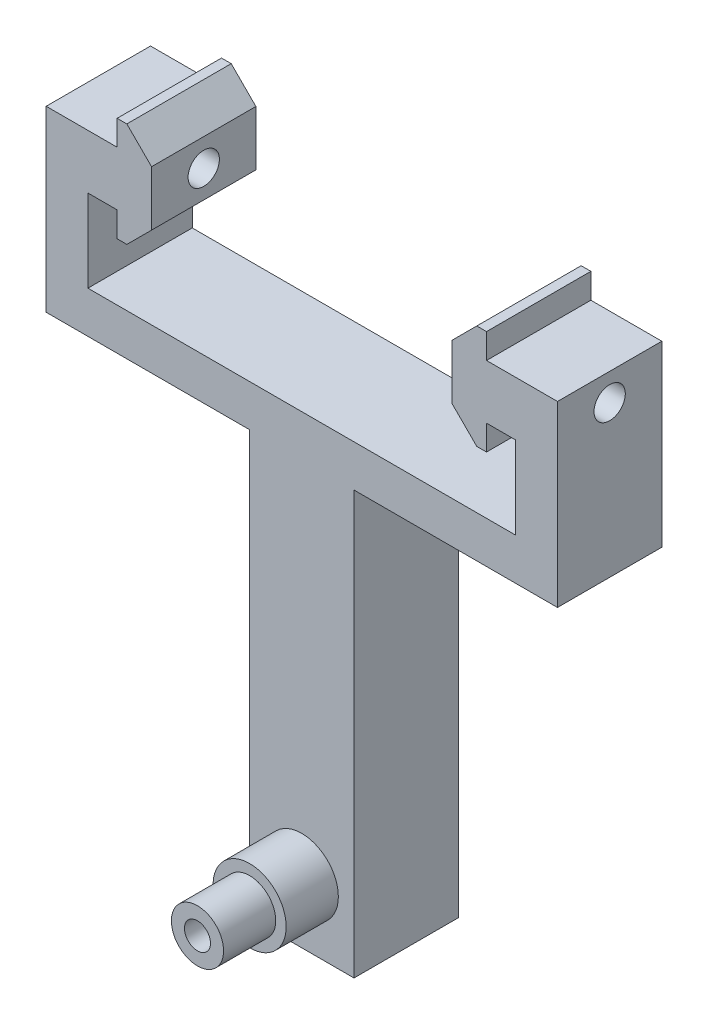
ISO-10303-21;
HEADER;
FILE_DESCRIPTION(('STEP AP214'),'2;1');
FILE_NAME('part.step','',(''),(''),'','','');
FILE_SCHEMA(('AUTOMOTIVE_DESIGN { 1 0 10303 214 1 1 1 1 }'));
ENDSEC;
DATA;
#1=APPLICATION_CONTEXT('core data for automotive mechanical design processes');
#2=APPLICATION_PROTOCOL_DEFINITION('international standard','automotive_design',2000,#1);
#3=PRODUCT_CONTEXT('',#1,'mechanical');
#4=PRODUCT('Part','Part','',(#3));
#5=PRODUCT_RELATED_PRODUCT_CATEGORY('part','',(#4));
#6=PRODUCT_DEFINITION_FORMATION('','',#4);
#7=PRODUCT_DEFINITION_CONTEXT('part definition',#1,'design');
#8=PRODUCT_DEFINITION('design','',#6,#7);
#9=PRODUCT_DEFINITION_SHAPE('','',#8);
#10=(LENGTH_UNIT() NAMED_UNIT(*) SI_UNIT(.MILLI.,.METRE.));
#11=(NAMED_UNIT(*) PLANE_ANGLE_UNIT() SI_UNIT($,.RADIAN.));
#12=(NAMED_UNIT(*) SI_UNIT($,.STERADIAN.) SOLID_ANGLE_UNIT());
#13=UNCERTAINTY_MEASURE_WITH_UNIT(LENGTH_MEASURE(1.E-05),#10,'distance_accuracy_value','');
#14=(GEOMETRIC_REPRESENTATION_CONTEXT(3) GLOBAL_UNCERTAINTY_ASSIGNED_CONTEXT((#13)) GLOBAL_UNIT_ASSIGNED_CONTEXT((#10,
#11,#12)) REPRESENTATION_CONTEXT('',''));
#15=CARTESIAN_POINT('',(0.,0.,0.));
#16=DIRECTION('',(0.,0.,1.));
#17=DIRECTION('',(1.,0.,0.));
#18=AXIS2_PLACEMENT_3D('',#15,#16,#17);
#19=CARTESIAN_POINT('',(-14.4999999999999,2.59999999999985,10.));
#20=DIRECTION('',(1.,0.,0.));
#21=DIRECTION('',(0.,1.,0.));
#22=AXIS2_PLACEMENT_3D('',#19,#20,#21);
#23=PLANE('',#22);
#24=CARTESIAN_POINT('',(-14.4999999999999,-1.62800247616818E-13,5.));
#25=DIRECTION('',(-1.,0.,0.));
#26=DIRECTION('',(0.,-1.,0.));
#27=AXIS2_PLACEMENT_3D('',#24,#25,#26);
#28=CIRCLE('',#27,1.5);
#29=CARTESIAN_POINT('',(-14.4999999999999,-1.50000000000016,5.));
#30=VERTEX_POINT('',#29);
#31=EDGE_CURVE('E445',#30,#30,#28,.T.);
#32=ORIENTED_EDGE('',*,*,#31,.F.);
#33=EDGE_LOOP('',(#32));
#34=FACE_BOUND('',#33,.T.);
#35=DIRECTION('',(0.,-1.,0.));
#36=VECTOR('',#35,1.);
#37=CARTESIAN_POINT('',(-14.4999999999999,2.59999999999985,0.));
#38=LINE('',#37,#36);
#39=CARTESIAN_POINT('',(-14.4999999999999,2.59999999999985,0.));
#40=VERTEX_POINT('',#39);
#41=CARTESIAN_POINT('',(-14.4999999999999,-14.5,0.));
#42=VERTEX_POINT('',#41);
#43=EDGE_CURVE('E262',#40,#42,#38,.T.);
#44=ORIENTED_EDGE('',*,*,#43,.T.);
#45=DIRECTION('',(0.,0.,-1.));
#46=VECTOR('',#45,1.);
#47=CARTESIAN_POINT('',(-14.4999999999999,-14.5,10.));
#48=LINE('',#47,#46);
#49=CARTESIAN_POINT('',(-14.4999999999999,-14.5,10.));
#50=VERTEX_POINT('',#49);
#51=EDGE_CURVE('E11',#50,#42,#48,.T.);
#52=ORIENTED_EDGE('',*,*,#51,.F.);
#53=DIRECTION('',(0.,-1.,0.));
#54=VECTOR('',#53,1.);
#55=CARTESIAN_POINT('',(-14.4999999999999,2.59999999999985,10.));
#56=LINE('',#55,#54);
#57=CARTESIAN_POINT('',(-14.4999999999999,2.59999999999985,10.));
#58=VERTEX_POINT('',#57);
#59=EDGE_CURVE('E345',#58,#50,#56,.T.);
#60=ORIENTED_EDGE('',*,*,#59,.F.);
#61=DIRECTION('',(0.,0.,-1.));
#62=VECTOR('',#61,1.);
#63=CARTESIAN_POINT('',(-14.4999999999999,2.59999999999985,10.));
#64=LINE('',#63,#62);
#65=EDGE_CURVE('E258',#58,#40,#64,.T.);
#66=ORIENTED_EDGE('',*,*,#65,.T.);
#67=EDGE_LOOP('',(#44,#52,#60,#66));
#68=FACE_BOUND('',#67,.T.);
#69=ADVANCED_FACE('F39',(#34,#68),#23,.F.);
#70=CARTESIAN_POINT('',(-14.4999999999999,-14.5,10.));
#71=DIRECTION('',(0.,1.,0.));
#72=DIRECTION('',(0.,0.,1.));
#73=AXIS2_PLACEMENT_3D('',#70,#71,#72);
#74=PLANE('',#73);
#75=DIRECTION('',(1.,0.,0.));
#76=VECTOR('',#75,1.);
#77=CARTESIAN_POINT('',(-14.4999999999999,-14.5,0.));
#78=LINE('',#77,#76);
#79=CARTESIAN_POINT('',(5.00000000000002,-14.5,0.));
#80=VERTEX_POINT('',#79);
#81=EDGE_CURVE('E266',#42,#80,#78,.T.);
#82=ORIENTED_EDGE('',*,*,#81,.T.);
#83=DIRECTION('',(0.,0.,-1.));
#84=VECTOR('',#83,1.);
#85=CARTESIAN_POINT('',(5.00000000000002,-14.5,10.));
#86=LINE('',#85,#84);
#87=CARTESIAN_POINT('',(5.00000000000002,-14.5,10.));
#88=VERTEX_POINT('',#87);
#89=EDGE_CURVE('E49',#88,#80,#86,.T.);
#90=ORIENTED_EDGE('',*,*,#89,.F.);
#91=DIRECTION('',(1.,0.,0.));
#92=VECTOR('',#91,1.);
#93=CARTESIAN_POINT('',(-14.4999999999999,-14.5,10.));
#94=LINE('',#93,#92);
#95=EDGE_CURVE('E161',#50,#88,#94,.T.);
#96=ORIENTED_EDGE('',*,*,#95,.F.);
#97=ORIENTED_EDGE('',*,*,#51,.T.);
#98=EDGE_LOOP('',(#82,#90,#96,#97));
#99=FACE_BOUND('',#98,.T.);
#100=ADVANCED_FACE('F565',(#99),#74,.F.);
#101=CARTESIAN_POINT('',(5.00000000000002,-14.5,10.));
#102=DIRECTION('',(1.,0.,0.));
#103=DIRECTION('',(0.,1.,0.));
#104=AXIS2_PLACEMENT_3D('',#101,#102,#103);
#105=PLANE('',#104);
#106=DIRECTION('',(0.,-1.,0.));
#107=VECTOR('',#106,1.);
#108=CARTESIAN_POINT('',(5.00000000000002,-14.5,0.));
#109=LINE('',#108,#107);
#110=CARTESIAN_POINT('',(5.00000000000002,-55.,0.));
#111=VERTEX_POINT('',#110);
#112=EDGE_CURVE('E270',#80,#111,#109,.T.);
#113=ORIENTED_EDGE('',*,*,#112,.T.);
#114=DIRECTION('',(0.,0.,-1.));
#115=VECTOR('',#114,1.);
#116=CARTESIAN_POINT('',(5.00000000000002,-55.,10.));
#117=LINE('',#116,#115);
#118=CARTESIAN_POINT('',(5.00000000000002,-55.,10.));
#119=VERTEX_POINT('',#118);
#120=EDGE_CURVE('E436',#119,#111,#117,.T.);
#121=ORIENTED_EDGE('',*,*,#120,.F.);
#122=DIRECTION('',(0.,-1.,0.));
#123=VECTOR('',#122,1.);
#124=CARTESIAN_POINT('',(5.00000000000002,-14.5,10.));
#125=LINE('',#124,#123);
#126=EDGE_CURVE('E470',#88,#119,#125,.T.);
#127=ORIENTED_EDGE('',*,*,#126,.F.);
#128=ORIENTED_EDGE('',*,*,#89,.T.);
#129=EDGE_LOOP('',(#113,#121,#127,#128));
#130=FACE_BOUND('',#129,.T.);
#131=ADVANCED_FACE('F570',(#130),#105,.F.);
#132=CARTESIAN_POINT('',(5.00000000000002,-55.,10.));
#133=DIRECTION('',(0.,1.,0.));
#134=DIRECTION('',(0.,0.,1.));
#135=AXIS2_PLACEMENT_3D('',#132,#133,#134);
#136=PLANE('',#135);
#137=DIRECTION('',(1.,0.,0.));
#138=VECTOR('',#137,1.);
#139=CARTESIAN_POINT('',(5.00000000000002,-55.,0.));
#140=LINE('',#139,#138);
#141=CARTESIAN_POINT('',(14.9999999999999,-55.,0.));
#142=VERTEX_POINT('',#141);
#143=EDGE_CURVE('E273',#111,#142,#140,.T.);
#144=ORIENTED_EDGE('',*,*,#143,.T.);
#145=DIRECTION('',(0.,0.,-1.));
#146=VECTOR('',#145,1.);
#147=CARTESIAN_POINT('',(14.9999999999999,-55.,10.));
#148=LINE('',#147,#146);
#149=CARTESIAN_POINT('',(14.9999999999999,-55.,10.));
#150=VERTEX_POINT('',#149);
#151=EDGE_CURVE('E432',#150,#142,#148,.T.);
#152=ORIENTED_EDGE('',*,*,#151,.F.);
#153=DIRECTION('',(1.,0.,0.));
#154=VECTOR('',#153,1.);
#155=CARTESIAN_POINT('',(5.00000000000002,-55.,10.));
#156=LINE('',#155,#154);
#157=EDGE_CURVE('E473',#119,#150,#156,.T.);
#158=ORIENTED_EDGE('',*,*,#157,.F.);
#159=ORIENTED_EDGE('',*,*,#120,.T.);
#160=EDGE_LOOP('',(#144,#152,#158,#159));
#161=FACE_BOUND('',#160,.T.);
#162=ADVANCED_FACE('F662',(#161),#136,.F.);
#163=CARTESIAN_POINT('',(15.,-14.5,10.));
#164=DIRECTION('',(-1.,0.,0.));
#165=DIRECTION('',(0.,-1.,0.));
#166=AXIS2_PLACEMENT_3D('',#163,#164,#165);
#167=PLANE('',#166);
#168=DIRECTION('',(0.,1.,0.));
#169=VECTOR('',#168,1.);
#170=CARTESIAN_POINT('',(15.,-14.5,0.));
#171=LINE('',#170,#169);
#172=CARTESIAN_POINT('',(15.,-14.5,0.));
#173=VERTEX_POINT('',#172);
#174=EDGE_CURVE('E276',#142,#173,#171,.T.);
#175=ORIENTED_EDGE('',*,*,#174,.T.);
#176=DIRECTION('',(0.,0.,-1.));
#177=VECTOR('',#176,1.);
#178=CARTESIAN_POINT('',(15.,-14.5,10.));
#179=LINE('',#178,#177);
#180=CARTESIAN_POINT('',(15.,-14.5,10.));
#181=VERTEX_POINT('',#180);
#182=EDGE_CURVE('E428',#181,#173,#179,.T.);
#183=ORIENTED_EDGE('',*,*,#182,.F.);
#184=DIRECTION('',(0.,1.,0.));
#185=VECTOR('',#184,1.);
#186=CARTESIAN_POINT('',(15.,-14.5,10.));
#187=LINE('',#186,#185);
#188=EDGE_CURVE('E476',#150,#181,#187,.T.);
#189=ORIENTED_EDGE('',*,*,#188,.F.);
#190=ORIENTED_EDGE('',*,*,#151,.T.);
#191=EDGE_LOOP('',(#175,#183,#189,#190));
#192=FACE_BOUND('',#191,.T.);
#193=ADVANCED_FACE('F658',(#192),#167,.F.);
#194=CARTESIAN_POINT('',(34.4999999999999,-14.5,10.));
#195=DIRECTION('',(0.,1.,0.));
#196=DIRECTION('',(-1.,0.,0.));
#197=AXIS2_PLACEMENT_3D('',#194,#195,#196);
#198=PLANE('',#197);
#199=DIRECTION('',(1.,0.,0.));
#200=VECTOR('',#199,1.);
#201=CARTESIAN_POINT('',(34.4999999999999,-14.5,0.));
#202=LINE('',#201,#200);
#203=CARTESIAN_POINT('',(34.4999999999999,-14.5,0.));
#204=VERTEX_POINT('',#203);
#205=EDGE_CURVE('E279',#173,#204,#202,.T.);
#206=ORIENTED_EDGE('',*,*,#205,.T.);
#207=DIRECTION('',(0.,0.,-1.));
#208=VECTOR('',#207,1.);
#209=CARTESIAN_POINT('',(34.4999999999999,-14.5,10.));
#210=LINE('',#209,#208);
#211=CARTESIAN_POINT('',(34.4999999999999,-14.5,10.));
#212=VERTEX_POINT('',#211);
#213=EDGE_CURVE('E424',#212,#204,#210,.T.);
#214=ORIENTED_EDGE('',*,*,#213,.F.);
#215=DIRECTION('',(1.,0.,0.));
#216=VECTOR('',#215,1.);
#217=CARTESIAN_POINT('',(34.4999999999999,-14.5,10.));
#218=LINE('',#217,#216);
#219=EDGE_CURVE('E479',#181,#212,#218,.T.);
#220=ORIENTED_EDGE('',*,*,#219,.F.);
#221=ORIENTED_EDGE('',*,*,#182,.T.);
#222=EDGE_LOOP('',(#206,#214,#220,#221));
#223=FACE_BOUND('',#222,.T.);
#224=ADVANCED_FACE('F654',(#223),#198,.F.);
#225=CARTESIAN_POINT('',(34.5,2.59999999999981,10.));
#226=DIRECTION('',(-1.,0.,0.));
#227=DIRECTION('',(0.,-1.,0.));
#228=AXIS2_PLACEMENT_3D('',#225,#226,#227);
#229=PLANE('',#228);
#230=CARTESIAN_POINT('',(34.5,-1.99836591292777E-13,5.));
#231=DIRECTION('',(1.,0.,0.));
#232=DIRECTION('',(0.,1.,0.));
#233=AXIS2_PLACEMENT_3D('',#230,#231,#232);
#234=CIRCLE('',#233,1.5);
#235=CARTESIAN_POINT('',(34.5,1.4999999999998,5.));
#236=VERTEX_POINT('',#235);
#237=EDGE_CURVE('E449',#236,#236,#234,.T.);
#238=ORIENTED_EDGE('',*,*,#237,.F.);
#239=EDGE_LOOP('',(#238));
#240=FACE_BOUND('',#239,.T.);
#241=DIRECTION('',(0.,1.,0.));
#242=VECTOR('',#241,1.);
#243=CARTESIAN_POINT('',(34.5,2.59999999999981,0.));
#244=LINE('',#243,#242);
#245=CARTESIAN_POINT('',(34.5,2.59999999999981,0.));
#246=VERTEX_POINT('',#245);
#247=EDGE_CURVE('E282',#204,#246,#244,.T.);
#248=ORIENTED_EDGE('',*,*,#247,.T.);
#249=DIRECTION('',(0.,0.,-1.));
#250=VECTOR('',#249,1.);
#251=CARTESIAN_POINT('',(34.5,2.59999999999981,10.));
#252=LINE('',#251,#250);
#253=CARTESIAN_POINT('',(34.5,2.59999999999981,10.));
#254=VERTEX_POINT('',#253);
#255=EDGE_CURVE('E420',#254,#246,#252,.T.);
#256=ORIENTED_EDGE('',*,*,#255,.F.);
#257=DIRECTION('',(0.,1.,0.));
#258=VECTOR('',#257,1.);
#259=CARTESIAN_POINT('',(34.5,2.59999999999981,10.));
#260=LINE('',#259,#258);
#261=EDGE_CURVE('E482',#212,#254,#260,.T.);
#262=ORIENTED_EDGE('',*,*,#261,.F.);
#263=ORIENTED_EDGE('',*,*,#213,.T.);
#264=EDGE_LOOP('',(#248,#256,#262,#263));
#265=FACE_BOUND('',#264,.T.);
#266=ADVANCED_FACE('F650',(#240,#265),#229,.F.);
#267=CARTESIAN_POINT('',(34.5,2.59999999999981,10.));
#268=DIRECTION('',(0.,-1.,0.));
#269=DIRECTION('',(1.,0.,0.));
#270=AXIS2_PLACEMENT_3D('',#267,#268,#269);
#271=PLANE('',#270);
#272=DIRECTION('',(-1.,0.,0.));
#273=VECTOR('',#272,1.);
#274=CARTESIAN_POINT('',(34.5,2.59999999999981,0.));
#275=LINE('',#274,#273);
#276=CARTESIAN_POINT('',(27.7000000000001,2.59999999999982,0.));
#277=VERTEX_POINT('',#276);
#278=EDGE_CURVE('E285',#246,#277,#275,.T.);
#279=ORIENTED_EDGE('',*,*,#278,.T.);
#280=DIRECTION('',(0.,0.,-1.));
#281=VECTOR('',#280,1.);
#282=CARTESIAN_POINT('',(27.7000000000001,2.59999999999982,10.));
#283=LINE('',#282,#281);
#284=CARTESIAN_POINT('',(27.7000000000001,2.59999999999982,10.));
#285=VERTEX_POINT('',#284);
#286=EDGE_CURVE('E416',#285,#277,#283,.T.);
#287=ORIENTED_EDGE('',*,*,#286,.F.);
#288=DIRECTION('',(-1.,0.,0.));
#289=VECTOR('',#288,1.);
#290=CARTESIAN_POINT('',(34.5,2.59999999999981,10.));
#291=LINE('',#290,#289);
#292=EDGE_CURVE('E485',#254,#285,#291,.T.);
#293=ORIENTED_EDGE('',*,*,#292,.F.);
#294=ORIENTED_EDGE('',*,*,#255,.T.);
#295=EDGE_LOOP('',(#279,#287,#293,#294));
#296=FACE_BOUND('',#295,.T.);
#297=ADVANCED_FACE('F646',(#296),#271,.F.);
#298=CARTESIAN_POINT('',(27.7000000000001,2.59999999999982,10.));
#299=DIRECTION('',(-1.,0.,0.));
#300=DIRECTION('',(0.,0.,1.));
#301=AXIS2_PLACEMENT_3D('',#298,#299,#300);
#302=PLANE('',#301);
#303=DIRECTION('',(0.,1.,0.));
#304=VECTOR('',#303,1.);
#305=CARTESIAN_POINT('',(27.7000000000001,2.59999999999982,0.));
#306=LINE('',#305,#304);
#307=CARTESIAN_POINT('',(27.7000000000001,4.99999999999982,0.));
#308=VERTEX_POINT('',#307);
#309=EDGE_CURVE('E288',#277,#308,#306,.T.);
#310=ORIENTED_EDGE('',*,*,#309,.T.);
#311=DIRECTION('',(0.,0.,-1.));
#312=VECTOR('',#311,1.);
#313=CARTESIAN_POINT('',(27.7000000000001,4.99999999999982,10.));
#314=LINE('',#313,#312);
#315=CARTESIAN_POINT('',(27.7000000000001,4.99999999999982,10.));
#316=VERTEX_POINT('',#315);
#317=EDGE_CURVE('E412',#316,#308,#314,.T.);
#318=ORIENTED_EDGE('',*,*,#317,.F.);
#319=DIRECTION('',(0.,1.,0.));
#320=VECTOR('',#319,1.);
#321=CARTESIAN_POINT('',(27.7000000000001,2.59999999999982,10.));
#322=LINE('',#321,#320);
#323=EDGE_CURVE('E488',#285,#316,#322,.T.);
#324=ORIENTED_EDGE('',*,*,#323,.F.);
#325=ORIENTED_EDGE('',*,*,#286,.T.);
#326=EDGE_LOOP('',(#310,#318,#324,#325));
#327=FACE_BOUND('',#326,.T.);
#328=ADVANCED_FACE('F642',(#327),#302,.F.);
#329=CARTESIAN_POINT('',(27.7000000000001,4.99999999999982,10.));
#330=DIRECTION('',(0.,-1.,0.));
#331=DIRECTION('',(1.,0.,0.));
#332=AXIS2_PLACEMENT_3D('',#329,#330,#331);
#333=PLANE('',#332);
#334=DIRECTION('',(-1.,0.,0.));
#335=VECTOR('',#334,1.);
#336=CARTESIAN_POINT('',(27.7000000000001,4.99999999999982,0.));
#337=LINE('',#336,#335);
#338=CARTESIAN_POINT('',(26.7677669529665,4.99999999999982,0.));
#339=VERTEX_POINT('',#338);
#340=EDGE_CURVE('E291',#308,#339,#337,.T.);
#341=ORIENTED_EDGE('',*,*,#340,.T.);
#342=DIRECTION('',(0.,0.,-1.));
#343=VECTOR('',#342,1.);
#344=CARTESIAN_POINT('',(26.7677669529665,4.99999999999982,10.));
#345=LINE('',#344,#343);
#346=CARTESIAN_POINT('',(26.7677669529665,4.99999999999982,10.));
#347=VERTEX_POINT('',#346);
#348=EDGE_CURVE('E408',#347,#339,#345,.T.);
#349=ORIENTED_EDGE('',*,*,#348,.F.);
#350=DIRECTION('',(-1.,0.,0.));
#351=VECTOR('',#350,1.);
#352=CARTESIAN_POINT('',(27.7000000000001,4.99999999999982,10.));
#353=LINE('',#352,#351);
#354=EDGE_CURVE('E491',#316,#347,#353,.T.);
#355=ORIENTED_EDGE('',*,*,#354,.F.);
#356=ORIENTED_EDGE('',*,*,#317,.T.);
#357=EDGE_LOOP('',(#341,#349,#355,#356));
#358=FACE_BOUND('',#357,.T.);
#359=ADVANCED_FACE('F638',(#358),#333,.F.);
#360=CARTESIAN_POINT('',(26.7677669529665,4.99999999999982,10.));
#361=DIRECTION('',(0.707106781186547,-0.707106781186548,0.));
#362=DIRECTION('',(0.707106781186548,0.707106781186547,0.));
#363=AXIS2_PLACEMENT_3D('',#360,#361,#362);
#364=PLANE('',#363);
#365=DIRECTION('',(-0.707106781186548,-0.707106781186547,0.));
#366=VECTOR('',#365,1.);
#367=CARTESIAN_POINT('',(26.7677669529665,4.99999999999982,0.));
#368=LINE('',#367,#366);
#369=CARTESIAN_POINT('',(24.4000000000001,2.63223304703345,0.));
#370=VERTEX_POINT('',#369);
#371=EDGE_CURVE('E294',#339,#370,#368,.T.);
#372=ORIENTED_EDGE('',*,*,#371,.T.);
#373=DIRECTION('',(0.,0.,-1.));
#374=VECTOR('',#373,1.);
#375=CARTESIAN_POINT('',(24.4000000000001,2.63223304703345,10.));
#376=LINE('',#375,#374);
#377=CARTESIAN_POINT('',(24.4000000000001,2.63223304703345,10.));
#378=VERTEX_POINT('',#377);
#379=EDGE_CURVE('E404',#378,#370,#376,.T.);
#380=ORIENTED_EDGE('',*,*,#379,.F.);
#381=DIRECTION('',(-0.707106781186548,-0.707106781186547,0.));
#382=VECTOR('',#381,1.);
#383=CARTESIAN_POINT('',(26.7677669529665,4.99999999999982,10.));
#384=LINE('',#383,#382);
#385=EDGE_CURVE('E494',#347,#378,#384,.T.);
#386=ORIENTED_EDGE('',*,*,#385,.F.);
#387=ORIENTED_EDGE('',*,*,#348,.T.);
#388=EDGE_LOOP('',(#372,#380,#386,#387));
#389=FACE_BOUND('',#388,.T.);
#390=ADVANCED_FACE('F635',(#389),#364,.F.);
#391=CARTESIAN_POINT('',(24.4000000000001,2.63223304703345,10.));
#392=DIRECTION('',(1.,0.,0.));
#393=DIRECTION('',(0.,1.,0.));
#394=AXIS2_PLACEMENT_3D('',#391,#392,#393);
#395=PLANE('',#394);
#396=CARTESIAN_POINT('',(24.4000000000001,-1.8344294721571E-13,5.));
#397=DIRECTION('',(1.,0.,0.));
#398=DIRECTION('',(0.,1.,0.));
#399=AXIS2_PLACEMENT_3D('',#396,#397,#398);
#400=CIRCLE('',#399,1.5);
#401=CARTESIAN_POINT('',(24.4000000000001,1.49999999999982,5.));
#402=VERTEX_POINT('',#401);
#403=EDGE_CURVE('E446',#402,#402,#400,.T.);
#404=ORIENTED_EDGE('',*,*,#403,.T.);
#405=EDGE_LOOP('',(#404));
#406=FACE_BOUND('',#405,.T.);
#407=DIRECTION('',(0.,-1.,0.));
#408=VECTOR('',#407,1.);
#409=CARTESIAN_POINT('',(24.4000000000001,2.63223304703345,0.));
#410=LINE('',#409,#408);
#411=CARTESIAN_POINT('',(24.4000000000001,-2.63223304703382,0.));
#412=VERTEX_POINT('',#411);
#413=EDGE_CURVE('E297',#370,#412,#410,.T.);
#414=ORIENTED_EDGE('',*,*,#413,.T.);
#415=DIRECTION('',(0.,0.,-1.));
#416=VECTOR('',#415,1.);
#417=CARTESIAN_POINT('',(24.4000000000001,-2.63223304703382,10.));
#418=LINE('',#417,#416);
#419=CARTESIAN_POINT('',(24.4000000000001,-2.63223304703382,10.));
#420=VERTEX_POINT('',#419);
#421=EDGE_CURVE('E400',#420,#412,#418,.T.);
#422=ORIENTED_EDGE('',*,*,#421,.F.);
#423=DIRECTION('',(0.,-1.,0.));
#424=VECTOR('',#423,1.);
#425=CARTESIAN_POINT('',(24.4000000000001,2.63223304703345,10.));
#426=LINE('',#425,#424);
#427=EDGE_CURVE('E497',#378,#420,#426,.T.);
#428=ORIENTED_EDGE('',*,*,#427,.F.);
#429=ORIENTED_EDGE('',*,*,#379,.T.);
#430=EDGE_LOOP('',(#414,#422,#428,#429));
#431=FACE_BOUND('',#430,.T.);
#432=ADVANCED_FACE('F631',(#406,#431),#395,.F.);
#433=CARTESIAN_POINT('',(24.4000000000001,-2.63223304703382,10.));
#434=DIRECTION('',(0.707106781186548,0.707106781186547,0.));
#435=DIRECTION('',(-0.707106781186547,0.707106781186548,0.));
#436=AXIS2_PLACEMENT_3D('',#433,#434,#435);
#437=PLANE('',#436);
#438=DIRECTION('',(0.707106781186547,-0.707106781186548,0.));
#439=VECTOR('',#438,1.);
#440=CARTESIAN_POINT('',(24.4000000000001,-2.63223304703382,0.));
#441=LINE('',#440,#439);
#442=CARTESIAN_POINT('',(26.7677669529664,-5.00000000000016,0.));
#443=VERTEX_POINT('',#442);
#444=EDGE_CURVE('E300',#412,#443,#441,.T.);
#445=ORIENTED_EDGE('',*,*,#444,.T.);
#446=DIRECTION('',(0.,0.,-1.));
#447=VECTOR('',#446,1.);
#448=CARTESIAN_POINT('',(26.7677669529664,-5.00000000000016,10.));
#449=LINE('',#448,#447);
#450=CARTESIAN_POINT('',(26.7677669529664,-5.00000000000016,10.));
#451=VERTEX_POINT('',#450);
#452=EDGE_CURVE('E396',#451,#443,#449,.T.);
#453=ORIENTED_EDGE('',*,*,#452,.F.);
#454=DIRECTION('',(0.707106781186547,-0.707106781186548,0.));
#455=VECTOR('',#454,1.);
#456=CARTESIAN_POINT('',(24.4000000000001,-2.63223304703382,10.));
#457=LINE('',#456,#455);
#458=EDGE_CURVE('E500',#420,#451,#457,.T.);
#459=ORIENTED_EDGE('',*,*,#458,.F.);
#460=ORIENTED_EDGE('',*,*,#421,.T.);
#461=EDGE_LOOP('',(#445,#453,#459,#460));
#462=FACE_BOUND('',#461,.T.);
#463=ADVANCED_FACE('F627',(#462),#437,.F.);
#464=CARTESIAN_POINT('',(26.7677669529664,-5.00000000000016,10.));
#465=DIRECTION('',(0.,1.,0.));
#466=DIRECTION('',(0.,0.,1.));
#467=AXIS2_PLACEMENT_3D('',#464,#465,#466);
#468=PLANE('',#467);
#469=DIRECTION('',(1.,0.,0.));
#470=VECTOR('',#469,1.);
#471=CARTESIAN_POINT('',(26.7677669529664,-5.00000000000016,0.));
#472=LINE('',#471,#470);
#473=CARTESIAN_POINT('',(27.6999999999999,-5.00000000000016,0.));
#474=VERTEX_POINT('',#473);
#475=EDGE_CURVE('E303',#443,#474,#472,.T.);
#476=ORIENTED_EDGE('',*,*,#475,.T.);
#477=DIRECTION('',(0.,0.,-1.));
#478=VECTOR('',#477,1.);
#479=CARTESIAN_POINT('',(27.6999999999999,-5.00000000000016,10.));
#480=LINE('',#479,#478);
#481=CARTESIAN_POINT('',(27.6999999999999,-5.00000000000016,10.));
#482=VERTEX_POINT('',#481);
#483=EDGE_CURVE('E392',#482,#474,#480,.T.);
#484=ORIENTED_EDGE('',*,*,#483,.F.);
#485=DIRECTION('',(1.,0.,0.));
#486=VECTOR('',#485,1.);
#487=CARTESIAN_POINT('',(26.7677669529664,-5.00000000000016,10.));
#488=LINE('',#487,#486);
#489=EDGE_CURVE('E503',#451,#482,#488,.T.);
#490=ORIENTED_EDGE('',*,*,#489,.F.);
#491=ORIENTED_EDGE('',*,*,#452,.T.);
#492=EDGE_LOOP('',(#476,#484,#490,#491));
#493=FACE_BOUND('',#492,.T.);
#494=ADVANCED_FACE('F623',(#493),#468,.F.);
#495=CARTESIAN_POINT('',(27.6999999999999,-5.00000000000016,10.));
#496=DIRECTION('',(-1.,0.,0.));
#497=DIRECTION('',(0.,0.,1.));
#498=AXIS2_PLACEMENT_3D('',#495,#496,#497);
#499=PLANE('',#498);
#500=DIRECTION('',(0.,1.,0.));
#501=VECTOR('',#500,1.);
#502=CARTESIAN_POINT('',(27.6999999999999,-5.00000000000016,0.));
#503=LINE('',#502,#501);
#504=CARTESIAN_POINT('',(27.6999999999999,-2.60000000000017,0.));
#505=VERTEX_POINT('',#504);
#506=EDGE_CURVE('E306',#474,#505,#503,.T.);
#507=ORIENTED_EDGE('',*,*,#506,.T.);
#508=DIRECTION('',(0.,0.,-1.));
#509=VECTOR('',#508,1.);
#510=CARTESIAN_POINT('',(27.6999999999999,-2.60000000000017,10.));
#511=LINE('',#510,#509);
#512=CARTESIAN_POINT('',(27.6999999999999,-2.60000000000017,10.));
#513=VERTEX_POINT('',#512);
#514=EDGE_CURVE('E388',#513,#505,#511,.T.);
#515=ORIENTED_EDGE('',*,*,#514,.F.);
#516=DIRECTION('',(0.,1.,0.));
#517=VECTOR('',#516,1.);
#518=CARTESIAN_POINT('',(27.6999999999999,-5.00000000000016,10.));
#519=LINE('',#518,#517);
#520=EDGE_CURVE('E506',#482,#513,#519,.T.);
#521=ORIENTED_EDGE('',*,*,#520,.F.);
#522=ORIENTED_EDGE('',*,*,#483,.T.);
#523=EDGE_LOOP('',(#507,#515,#521,#522));
#524=FACE_BOUND('',#523,.T.);
#525=ADVANCED_FACE('F619',(#524),#499,.F.);
#526=CARTESIAN_POINT('',(27.6999999999999,-2.60000000000017,10.));
#527=DIRECTION('',(0.,1.,0.));
#528=DIRECTION('',(-1.,0.,0.));
#529=AXIS2_PLACEMENT_3D('',#526,#527,#528);
#530=PLANE('',#529);
#531=DIRECTION('',(1.,0.,0.));
#532=VECTOR('',#531,1.);
#533=CARTESIAN_POINT('',(27.6999999999999,-2.60000000000017,0.));
#534=LINE('',#533,#532);
#535=CARTESIAN_POINT('',(30.5,-2.60000000000017,0.));
#536=VERTEX_POINT('',#535);
#537=EDGE_CURVE('E309',#505,#536,#534,.T.);
#538=ORIENTED_EDGE('',*,*,#537,.T.);
#539=DIRECTION('',(0.,0.,-1.));
#540=VECTOR('',#539,1.);
#541=CARTESIAN_POINT('',(30.5,-2.60000000000017,10.));
#542=LINE('',#541,#540);
#543=CARTESIAN_POINT('',(30.5,-2.60000000000017,10.));
#544=VERTEX_POINT('',#543);
#545=EDGE_CURVE('E384',#544,#536,#542,.T.);
#546=ORIENTED_EDGE('',*,*,#545,.F.);
#547=DIRECTION('',(1.,0.,0.));
#548=VECTOR('',#547,1.);
#549=CARTESIAN_POINT('',(27.6999999999999,-2.60000000000017,10.));
#550=LINE('',#549,#548);
#551=EDGE_CURVE('E509',#513,#544,#550,.T.);
#552=ORIENTED_EDGE('',*,*,#551,.F.);
#553=ORIENTED_EDGE('',*,*,#514,.T.);
#554=EDGE_LOOP('',(#538,#546,#552,#553));
#555=FACE_BOUND('',#554,.T.);
#556=ADVANCED_FACE('F615',(#555),#530,.F.);
#557=CARTESIAN_POINT('',(30.5,-2.60000000000017,10.));
#558=DIRECTION('',(1.,0.,0.));
#559=DIRECTION('',(0.,1.,0.));
#560=AXIS2_PLACEMENT_3D('',#557,#558,#559);
#561=PLANE('',#560);
#562=DIRECTION('',(0.,-1.,0.));
#563=VECTOR('',#562,1.);
#564=CARTESIAN_POINT('',(30.5,-2.60000000000017,0.));
#565=LINE('',#564,#563);
#566=CARTESIAN_POINT('',(30.4999999999999,-10.5,0.));
#567=VERTEX_POINT('',#566);
#568=EDGE_CURVE('E312',#536,#567,#565,.T.);
#569=ORIENTED_EDGE('',*,*,#568,.T.);
#570=DIRECTION('',(0.,0.,-1.));
#571=VECTOR('',#570,1.);
#572=CARTESIAN_POINT('',(30.4999999999999,-10.5,10.));
#573=LINE('',#572,#571);
#574=CARTESIAN_POINT('',(30.4999999999999,-10.5,10.));
#575=VERTEX_POINT('',#574);
#576=EDGE_CURVE('E380',#575,#567,#573,.T.);
#577=ORIENTED_EDGE('',*,*,#576,.F.);
#578=DIRECTION('',(0.,-1.,0.));
#579=VECTOR('',#578,1.);
#580=CARTESIAN_POINT('',(30.5,-2.60000000000017,10.));
#581=LINE('',#580,#579);
#582=EDGE_CURVE('E512',#544,#575,#581,.T.);
#583=ORIENTED_EDGE('',*,*,#582,.F.);
#584=ORIENTED_EDGE('',*,*,#545,.T.);
#585=EDGE_LOOP('',(#569,#577,#583,#584));
#586=FACE_BOUND('',#585,.T.);
#587=ADVANCED_FACE('F611',(#586),#561,.F.);
#588=CARTESIAN_POINT('',(-10.4999999999999,-10.5,10.));
#589=DIRECTION('',(0.,-1.,0.));
#590=DIRECTION('',(1.,0.,0.));
#591=AXIS2_PLACEMENT_3D('',#588,#589,#590);
#592=PLANE('',#591);
#593=DIRECTION('',(-1.,0.,0.));
#594=VECTOR('',#593,1.);
#595=CARTESIAN_POINT('',(-10.4999999999999,-10.5,0.));
#596=LINE('',#595,#594);
#597=CARTESIAN_POINT('',(-10.4999999999999,-10.5,0.));
#598=VERTEX_POINT('',#597);
#599=EDGE_CURVE('E315',#567,#598,#596,.T.);
#600=ORIENTED_EDGE('',*,*,#599,.T.);
#601=DIRECTION('',(0.,0.,-1.));
#602=VECTOR('',#601,1.);
#603=CARTESIAN_POINT('',(-10.4999999999999,-10.5,10.));
#604=LINE('',#603,#602);
#605=CARTESIAN_POINT('',(-10.4999999999999,-10.5,10.));
#606=VERTEX_POINT('',#605);
#607=EDGE_CURVE('E376',#606,#598,#604,.T.);
#608=ORIENTED_EDGE('',*,*,#607,.F.);
#609=DIRECTION('',(-1.,0.,0.));
#610=VECTOR('',#609,1.);
#611=CARTESIAN_POINT('',(-10.4999999999999,-10.5,10.));
#612=LINE('',#611,#610);
#613=EDGE_CURVE('E515',#575,#606,#612,.T.);
#614=ORIENTED_EDGE('',*,*,#613,.F.);
#615=ORIENTED_EDGE('',*,*,#576,.T.);
#616=EDGE_LOOP('',(#600,#608,#614,#615));
#617=FACE_BOUND('',#616,.T.);
#618=ADVANCED_FACE('F607',(#617),#592,.F.);
#619=CARTESIAN_POINT('',(-10.4999999999999,-2.60000000000014,10.));
#620=DIRECTION('',(-1.,0.,0.));
#621=DIRECTION('',(0.,-1.,0.));
#622=AXIS2_PLACEMENT_3D('',#619,#620,#621);
#623=PLANE('',#622);
#624=DIRECTION('',(0.,1.,0.));
#625=VECTOR('',#624,1.);
#626=CARTESIAN_POINT('',(-10.4999999999999,-2.60000000000014,0.));
#627=LINE('',#626,#625);
#628=CARTESIAN_POINT('',(-10.4999999999999,-2.60000000000014,0.));
#629=VERTEX_POINT('',#628);
#630=EDGE_CURVE('E318',#598,#629,#627,.T.);
#631=ORIENTED_EDGE('',*,*,#630,.T.);
#632=DIRECTION('',(0.,0.,-1.));
#633=VECTOR('',#632,1.);
#634=CARTESIAN_POINT('',(-10.4999999999999,-2.60000000000014,10.));
#635=LINE('',#634,#633);
#636=CARTESIAN_POINT('',(-10.4999999999999,-2.60000000000014,10.));
#637=VERTEX_POINT('',#636);
#638=EDGE_CURVE('E372',#637,#629,#635,.T.);
#639=ORIENTED_EDGE('',*,*,#638,.F.);
#640=DIRECTION('',(0.,1.,0.));
#641=VECTOR('',#640,1.);
#642=CARTESIAN_POINT('',(-10.4999999999999,-2.60000000000014,10.));
#643=LINE('',#642,#641);
#644=EDGE_CURVE('E518',#606,#637,#643,.T.);
#645=ORIENTED_EDGE('',*,*,#644,.F.);
#646=ORIENTED_EDGE('',*,*,#607,.T.);
#647=EDGE_LOOP('',(#631,#639,#645,#646));
#648=FACE_BOUND('',#647,.T.);
#649=ADVANCED_FACE('F603',(#648),#623,.F.);
#650=CARTESIAN_POINT('',(-7.69999999999991,-2.60000000000014,10.));
#651=DIRECTION('',(0.,1.,0.));
#652=DIRECTION('',(-1.,0.,0.));
#653=AXIS2_PLACEMENT_3D('',#650,#651,#652);
#654=PLANE('',#653);
#655=DIRECTION('',(1.,0.,0.));
#656=VECTOR('',#655,1.);
#657=CARTESIAN_POINT('',(-7.69999999999991,-2.60000000000014,0.));
#658=LINE('',#657,#656);
#659=CARTESIAN_POINT('',(-7.69999999999991,-2.60000000000014,0.));
#660=VERTEX_POINT('',#659);
#661=EDGE_CURVE('E321',#629,#660,#658,.T.);
#662=ORIENTED_EDGE('',*,*,#661,.T.);
#663=DIRECTION('',(0.,0.,-1.));
#664=VECTOR('',#663,1.);
#665=CARTESIAN_POINT('',(-7.69999999999991,-2.60000000000014,10.));
#666=LINE('',#665,#664);
#667=CARTESIAN_POINT('',(-7.69999999999991,-2.60000000000014,10.));
#668=VERTEX_POINT('',#667);
#669=EDGE_CURVE('E368',#668,#660,#666,.T.);
#670=ORIENTED_EDGE('',*,*,#669,.F.);
#671=DIRECTION('',(1.,0.,0.));
#672=VECTOR('',#671,1.);
#673=CARTESIAN_POINT('',(-7.69999999999991,-2.60000000000014,10.));
#674=LINE('',#673,#672);
#675=EDGE_CURVE('E521',#637,#668,#674,.T.);
#676=ORIENTED_EDGE('',*,*,#675,.F.);
#677=ORIENTED_EDGE('',*,*,#638,.T.);
#678=EDGE_LOOP('',(#662,#670,#676,#677));
#679=FACE_BOUND('',#678,.T.);
#680=ADVANCED_FACE('F599',(#679),#654,.F.);
#681=CARTESIAN_POINT('',(-7.69999999999991,-5.00000000000014,10.));
#682=DIRECTION('',(1.,0.,0.));
#683=DIRECTION('',(0.,0.,-1.));
#684=AXIS2_PLACEMENT_3D('',#681,#682,#683);
#685=PLANE('',#684);
#686=DIRECTION('',(0.,-1.,0.));
#687=VECTOR('',#686,1.);
#688=CARTESIAN_POINT('',(-7.69999999999991,-5.00000000000014,0.));
#689=LINE('',#688,#687);
#690=CARTESIAN_POINT('',(-7.69999999999991,-5.00000000000014,0.));
#691=VERTEX_POINT('',#690);
#692=EDGE_CURVE('E324',#660,#691,#689,.T.);
#693=ORIENTED_EDGE('',*,*,#692,.T.);
#694=DIRECTION('',(0.,0.,-1.));
#695=VECTOR('',#694,1.);
#696=CARTESIAN_POINT('',(-7.69999999999991,-5.00000000000014,10.));
#697=LINE('',#696,#695);
#698=CARTESIAN_POINT('',(-7.69999999999991,-5.00000000000014,10.));
#699=VERTEX_POINT('',#698);
#700=EDGE_CURVE('E364',#699,#691,#697,.T.);
#701=ORIENTED_EDGE('',*,*,#700,.F.);
#702=DIRECTION('',(0.,-1.,0.));
#703=VECTOR('',#702,1.);
#704=CARTESIAN_POINT('',(-7.69999999999991,-5.00000000000014,10.));
#705=LINE('',#704,#703);
#706=EDGE_CURVE('E524',#668,#699,#705,.T.);
#707=ORIENTED_EDGE('',*,*,#706,.F.);
#708=ORIENTED_EDGE('',*,*,#669,.T.);
#709=EDGE_LOOP('',(#693,#701,#707,#708));
#710=FACE_BOUND('',#709,.T.);
#711=ADVANCED_FACE('F595',(#710),#685,.F.);
#712=CARTESIAN_POINT('',(-6.7677669529664,-5.00000000000014,10.));
#713=DIRECTION('',(0.,1.,0.));
#714=DIRECTION('',(0.,0.,1.));
#715=AXIS2_PLACEMENT_3D('',#712,#713,#714);
#716=PLANE('',#715);
#717=DIRECTION('',(1.,0.,0.));
#718=VECTOR('',#717,1.);
#719=CARTESIAN_POINT('',(-6.7677669529664,-5.00000000000014,0.));
#720=LINE('',#719,#718);
#721=CARTESIAN_POINT('',(-6.7677669529664,-5.00000000000014,0.));
#722=VERTEX_POINT('',#721);
#723=EDGE_CURVE('E327',#691,#722,#720,.T.);
#724=ORIENTED_EDGE('',*,*,#723,.T.);
#725=DIRECTION('',(0.,0.,-1.));
#726=VECTOR('',#725,1.);
#727=CARTESIAN_POINT('',(-6.7677669529664,-5.00000000000014,10.));
#728=LINE('',#727,#726);
#729=CARTESIAN_POINT('',(-6.7677669529664,-5.00000000000014,10.));
#730=VERTEX_POINT('',#729);
#731=EDGE_CURVE('E360',#730,#722,#728,.T.);
#732=ORIENTED_EDGE('',*,*,#731,.F.);
#733=DIRECTION('',(1.,0.,0.));
#734=VECTOR('',#733,1.);
#735=CARTESIAN_POINT('',(-6.7677669529664,-5.00000000000014,10.));
#736=LINE('',#735,#734);
#737=EDGE_CURVE('E527',#699,#730,#736,.T.);
#738=ORIENTED_EDGE('',*,*,#737,.F.);
#739=ORIENTED_EDGE('',*,*,#700,.T.);
#740=EDGE_LOOP('',(#724,#732,#738,#739));
#741=FACE_BOUND('',#740,.T.);
#742=ADVANCED_FACE('F588',(#741),#716,.F.);
#743=CARTESIAN_POINT('',(-4.40000000000005,-2.6322330470338,10.));
#744=DIRECTION('',(-0.707106781186547,0.707106781186548,0.));
#745=DIRECTION('',(-0.707106781186548,-0.707106781186547,0.));
#746=AXIS2_PLACEMENT_3D('',#743,#744,#745);
#747=PLANE('',#746);
#748=DIRECTION('',(0.707106781186548,0.707106781186547,0.));
#749=VECTOR('',#748,1.);
#750=CARTESIAN_POINT('',(-4.40000000000005,-2.6322330470338,0.));
#751=LINE('',#750,#749);
#752=CARTESIAN_POINT('',(-4.40000000000005,-2.6322330470338,0.));
#753=VERTEX_POINT('',#752);
#754=EDGE_CURVE('E330',#722,#753,#751,.T.);
#755=ORIENTED_EDGE('',*,*,#754,.T.);
#756=DIRECTION('',(0.,0.,-1.));
#757=VECTOR('',#756,1.);
#758=CARTESIAN_POINT('',(-4.40000000000005,-2.6322330470338,10.));
#759=LINE('',#758,#757);
#760=CARTESIAN_POINT('',(-4.40000000000005,-2.6322330470338,10.));
#761=VERTEX_POINT('',#760);
#762=EDGE_CURVE('E356',#761,#753,#759,.T.);
#763=ORIENTED_EDGE('',*,*,#762,.F.);
#764=DIRECTION('',(0.707106781186548,0.707106781186547,0.));
#765=VECTOR('',#764,1.);
#766=CARTESIAN_POINT('',(-4.40000000000005,-2.6322330470338,10.));
#767=LINE('',#766,#765);
#768=EDGE_CURVE('E530',#730,#761,#767,.T.);
#769=ORIENTED_EDGE('',*,*,#768,.F.);
#770=ORIENTED_EDGE('',*,*,#731,.T.);
#771=EDGE_LOOP('',(#755,#763,#769,#770));
#772=FACE_BOUND('',#771,.T.);
#773=ADVANCED_FACE('F581',(#772),#747,.F.);
#774=CARTESIAN_POINT('',(-4.40000000000005,2.63223304703347,10.));
#775=DIRECTION('',(-1.,0.,0.));
#776=DIRECTION('',(0.,-1.,0.));
#777=AXIS2_PLACEMENT_3D('',#774,#775,#776);
#778=PLANE('',#777);
#779=CARTESIAN_POINT('',(-4.40000000000005,-1.61775644862001E-13,5.));
#780=DIRECTION('',(-1.,0.,0.));
#781=DIRECTION('',(0.,-1.,0.));
#782=AXIS2_PLACEMENT_3D('',#779,#780,#781);
#783=CIRCLE('',#782,1.5);
#784=CARTESIAN_POINT('',(-4.40000000000005,-1.50000000000016,5.));
#785=VERTEX_POINT('',#784);
#786=EDGE_CURVE('E267',#785,#785,#783,.T.);
#787=ORIENTED_EDGE('',*,*,#786,.T.);
#788=EDGE_LOOP('',(#787));
#789=FACE_BOUND('',#788,.T.);
#790=DIRECTION('',(0.,1.,0.));
#791=VECTOR('',#790,1.);
#792=CARTESIAN_POINT('',(-4.40000000000005,2.63223304703347,0.));
#793=LINE('',#792,#791);
#794=CARTESIAN_POINT('',(-4.40000000000005,2.63223304703347,0.));
#795=VERTEX_POINT('',#794);
#796=EDGE_CURVE('E333',#753,#795,#793,.T.);
#797=ORIENTED_EDGE('',*,*,#796,.T.);
#798=DIRECTION('',(0.,0.,-1.));
#799=VECTOR('',#798,1.);
#800=CARTESIAN_POINT('',(-4.40000000000005,2.63223304703347,10.));
#801=LINE('',#800,#799);
#802=CARTESIAN_POINT('',(-4.40000000000005,2.63223304703347,10.));
#803=VERTEX_POINT('',#802);
#804=EDGE_CURVE('E352',#803,#795,#801,.T.);
#805=ORIENTED_EDGE('',*,*,#804,.F.);
#806=DIRECTION('',(0.,1.,0.));
#807=VECTOR('',#806,1.);
#808=CARTESIAN_POINT('',(-4.40000000000005,2.63223304703347,10.));
#809=LINE('',#808,#807);
#810=EDGE_CURVE('E533',#761,#803,#809,.T.);
#811=ORIENTED_EDGE('',*,*,#810,.F.);
#812=ORIENTED_EDGE('',*,*,#762,.T.);
#813=EDGE_LOOP('',(#797,#805,#811,#812));
#814=FACE_BOUND('',#813,.T.);
#815=ADVANCED_FACE('F541',(#789,#814),#778,.F.);
#816=CARTESIAN_POINT('',(-6.76776695296643,4.99999999999984,10.));
#817=DIRECTION('',(-0.707106781186548,-0.707106781186548,0.));
#818=DIRECTION('',(0.707106781186548,-0.707106781186548,0.));
#819=AXIS2_PLACEMENT_3D('',#816,#817,#818);
#820=PLANE('',#819);
#821=DIRECTION('',(-0.707106781186548,0.707106781186548,0.));
#822=VECTOR('',#821,1.);
#823=CARTESIAN_POINT('',(-6.76776695296643,4.99999999999984,0.));
#824=LINE('',#823,#822);
#825=CARTESIAN_POINT('',(-6.76776695296643,4.99999999999984,0.));
#826=VERTEX_POINT('',#825);
#827=EDGE_CURVE('E336',#795,#826,#824,.T.);
#828=ORIENTED_EDGE('',*,*,#827,.T.);
#829=DIRECTION('',(0.,0.,-1.));
#830=VECTOR('',#829,1.);
#831=CARTESIAN_POINT('',(-6.76776695296643,4.99999999999984,10.));
#832=LINE('',#831,#830);
#833=CARTESIAN_POINT('',(-6.76776695296643,4.99999999999984,10.));
#834=VERTEX_POINT('',#833);
#835=EDGE_CURVE('E251',#834,#826,#832,.T.);
#836=ORIENTED_EDGE('',*,*,#835,.F.);
#837=DIRECTION('',(-0.707106781186548,0.707106781186548,0.));
#838=VECTOR('',#837,1.);
#839=CARTESIAN_POINT('',(-6.76776695296643,4.99999999999984,10.));
#840=LINE('',#839,#838);
#841=EDGE_CURVE('E240',#803,#834,#840,.T.);
#842=ORIENTED_EDGE('',*,*,#841,.F.);
#843=ORIENTED_EDGE('',*,*,#804,.T.);
#844=EDGE_LOOP('',(#828,#836,#842,#843));
#845=FACE_BOUND('',#844,.T.);
#846=ADVANCED_FACE('F545',(#845),#820,.F.);
#847=CARTESIAN_POINT('',(-7.70000000000006,4.99999999999984,10.));
#848=DIRECTION('',(0.,-1.,0.));
#849=DIRECTION('',(0.,0.,-1.));
#850=AXIS2_PLACEMENT_3D('',#847,#848,#849);
#851=PLANE('',#850);
#852=DIRECTION('',(-1.,0.,0.));
#853=VECTOR('',#852,1.);
#854=CARTESIAN_POINT('',(-7.70000000000006,4.99999999999984,0.));
#855=LINE('',#854,#853);
#856=CARTESIAN_POINT('',(-7.70000000000006,4.99999999999984,0.));
#857=VERTEX_POINT('',#856);
#858=EDGE_CURVE('E249',#826,#857,#855,.T.);
#859=ORIENTED_EDGE('',*,*,#858,.T.);
#860=DIRECTION('',(0.,0.,-1.));
#861=VECTOR('',#860,1.);
#862=CARTESIAN_POINT('',(-7.70000000000006,4.99999999999984,10.));
#863=LINE('',#862,#861);
#864=CARTESIAN_POINT('',(-7.70000000000006,4.99999999999984,10.));
#865=VERTEX_POINT('',#864);
#866=EDGE_CURVE('E246',#865,#857,#863,.T.);
#867=ORIENTED_EDGE('',*,*,#866,.F.);
#868=DIRECTION('',(-1.,0.,0.));
#869=VECTOR('',#868,1.);
#870=CARTESIAN_POINT('',(-7.70000000000006,4.99999999999984,10.));
#871=LINE('',#870,#869);
#872=EDGE_CURVE('E234',#834,#865,#871,.T.);
#873=ORIENTED_EDGE('',*,*,#872,.F.);
#874=ORIENTED_EDGE('',*,*,#835,.T.);
#875=EDGE_LOOP('',(#859,#867,#873,#874));
#876=FACE_BOUND('',#875,.T.);
#877=ADVANCED_FACE('F247',(#876),#851,.F.);
#878=CARTESIAN_POINT('',(-7.70000000000006,2.59999999999985,10.));
#879=DIRECTION('',(1.,0.,0.));
#880=DIRECTION('',(0.,0.,-1.));
#881=AXIS2_PLACEMENT_3D('',#878,#879,#880);
#882=PLANE('',#881);
#883=DIRECTION('',(0.,-1.,0.));
#884=VECTOR('',#883,1.);
#885=CARTESIAN_POINT('',(-7.70000000000006,2.59999999999985,0.));
#886=LINE('',#885,#884);
#887=CARTESIAN_POINT('',(-7.70000000000006,2.59999999999985,0.));
#888=VERTEX_POINT('',#887);
#889=EDGE_CURVE('E147',#857,#888,#886,.T.);
#890=ORIENTED_EDGE('',*,*,#889,.T.);
#891=DIRECTION('',(0.,0.,-1.));
#892=VECTOR('',#891,1.);
#893=CARTESIAN_POINT('',(-7.70000000000006,2.59999999999985,10.));
#894=LINE('',#893,#892);
#895=CARTESIAN_POINT('',(-7.70000000000006,2.59999999999985,10.));
#896=VERTEX_POINT('',#895);
#897=EDGE_CURVE('E252',#896,#888,#894,.T.);
#898=ORIENTED_EDGE('',*,*,#897,.F.);
#899=DIRECTION('',(0.,-1.,0.));
#900=VECTOR('',#899,1.);
#901=CARTESIAN_POINT('',(-7.70000000000006,2.59999999999985,10.));
#902=LINE('',#901,#900);
#903=EDGE_CURVE('E238',#865,#896,#902,.T.);
#904=ORIENTED_EDGE('',*,*,#903,.F.);
#905=ORIENTED_EDGE('',*,*,#866,.T.);
#906=EDGE_LOOP('',(#890,#898,#904,#905));
#907=FACE_BOUND('',#906,.T.);
#908=ADVANCED_FACE('F254',(#907),#882,.F.);
#909=CARTESIAN_POINT('',(-14.4999999999999,2.59999999999985,10.));
#910=DIRECTION('',(0.,-1.,0.));
#911=DIRECTION('',(0.,0.,-1.));
#912=AXIS2_PLACEMENT_3D('',#909,#910,#911);
#913=PLANE('',#912);
#914=DIRECTION('',(-1.,0.,0.));
#915=VECTOR('',#914,1.);
#916=CARTESIAN_POINT('',(-14.4999999999999,2.59999999999985,0.));
#917=LINE('',#916,#915);
#918=EDGE_CURVE('E153',#888,#40,#917,.T.);
#919=ORIENTED_EDGE('',*,*,#918,.T.);
#920=ORIENTED_EDGE('',*,*,#65,.F.);
#921=DIRECTION('',(-1.,0.,0.));
#922=VECTOR('',#921,1.);
#923=CARTESIAN_POINT('',(-14.4999999999999,2.59999999999985,10.));
#924=LINE('',#923,#922);
#925=EDGE_CURVE('E58',#896,#58,#924,.T.);
#926=ORIENTED_EDGE('',*,*,#925,.F.);
#927=ORIENTED_EDGE('',*,*,#897,.T.);
#928=EDGE_LOOP('',(#919,#920,#926,#927));
#929=FACE_BOUND('',#928,.T.);
#930=ADVANCED_FACE('F553',(#929),#913,.F.);
#931=CARTESIAN_POINT('',(0.,0.,10.));
#932=DIRECTION('',(0.,0.,1.));
#933=DIRECTION('',(1.,0.,0.));
#934=AXIS2_PLACEMENT_3D('',#931,#932,#933);
#935=PLANE('',#934);
#936=CARTESIAN_POINT('',(9.99999999999997,-49.,10.));
#937=DIRECTION('',(0.,0.,1.));
#938=DIRECTION('',(1.,0.,0.));
#939=AXIS2_PLACEMENT_3D('',#936,#937,#938);
#940=CIRCLE('',#939,3.5);
#941=CARTESIAN_POINT('',(13.5,-49.,10.));
#942=VERTEX_POINT('',#941);
#943=EDGE_CURVE('E938',#942,#942,#940,.T.);
#944=ORIENTED_EDGE('',*,*,#943,.F.);
#945=EDGE_LOOP('',(#944));
#946=FACE_BOUND('',#945,.T.);
#947=ORIENTED_EDGE('',*,*,#59,.T.);
#948=ORIENTED_EDGE('',*,*,#95,.T.);
#949=ORIENTED_EDGE('',*,*,#126,.T.);
#950=ORIENTED_EDGE('',*,*,#157,.T.);
#951=ORIENTED_EDGE('',*,*,#188,.T.);
#952=ORIENTED_EDGE('',*,*,#219,.T.);
#953=ORIENTED_EDGE('',*,*,#261,.T.);
#954=ORIENTED_EDGE('',*,*,#292,.T.);
#955=ORIENTED_EDGE('',*,*,#323,.T.);
#956=ORIENTED_EDGE('',*,*,#354,.T.);
#957=ORIENTED_EDGE('',*,*,#385,.T.);
#958=ORIENTED_EDGE('',*,*,#427,.T.);
#959=ORIENTED_EDGE('',*,*,#458,.T.);
#960=ORIENTED_EDGE('',*,*,#489,.T.);
#961=ORIENTED_EDGE('',*,*,#520,.T.);
#962=ORIENTED_EDGE('',*,*,#551,.T.);
#963=ORIENTED_EDGE('',*,*,#582,.T.);
#964=ORIENTED_EDGE('',*,*,#613,.T.);
#965=ORIENTED_EDGE('',*,*,#644,.T.);
#966=ORIENTED_EDGE('',*,*,#675,.T.);
#967=ORIENTED_EDGE('',*,*,#706,.T.);
#968=ORIENTED_EDGE('',*,*,#737,.T.);
#969=ORIENTED_EDGE('',*,*,#768,.T.);
#970=ORIENTED_EDGE('',*,*,#810,.T.);
#971=ORIENTED_EDGE('',*,*,#841,.T.);
#972=ORIENTED_EDGE('',*,*,#872,.T.);
#973=ORIENTED_EDGE('',*,*,#903,.T.);
#974=ORIENTED_EDGE('',*,*,#925,.T.);
#975=EDGE_LOOP('',(#947,#948,#949,#950,#951,#952,#953,#954,#955,#956,#957,#958,#959,#960,#961,
#962,#963,#964,#965,#966,#967,#968,#969,#970,#971,#972,#973,#974));
#976=FACE_BOUND('',#975,.T.);
#977=ADVANCED_FACE('F236',(#946,#976),#935,.T.);
#978=CARTESIAN_POINT('',(0.,0.,0.));
#979=DIRECTION('',(0.,0.,1.));
#980=DIRECTION('',(1.,0.,0.));
#981=AXIS2_PLACEMENT_3D('',#978,#979,#980);
#982=PLANE('',#981);
#983=ORIENTED_EDGE('',*,*,#43,.F.);
#984=ORIENTED_EDGE('',*,*,#918,.F.);
#985=ORIENTED_EDGE('',*,*,#889,.F.);
#986=ORIENTED_EDGE('',*,*,#858,.F.);
#987=ORIENTED_EDGE('',*,*,#827,.F.);
#988=ORIENTED_EDGE('',*,*,#796,.F.);
#989=ORIENTED_EDGE('',*,*,#754,.F.);
#990=ORIENTED_EDGE('',*,*,#723,.F.);
#991=ORIENTED_EDGE('',*,*,#692,.F.);
#992=ORIENTED_EDGE('',*,*,#661,.F.);
#993=ORIENTED_EDGE('',*,*,#630,.F.);
#994=ORIENTED_EDGE('',*,*,#599,.F.);
#995=ORIENTED_EDGE('',*,*,#568,.F.);
#996=ORIENTED_EDGE('',*,*,#537,.F.);
#997=ORIENTED_EDGE('',*,*,#506,.F.);
#998=ORIENTED_EDGE('',*,*,#475,.F.);
#999=ORIENTED_EDGE('',*,*,#444,.F.);
#1000=ORIENTED_EDGE('',*,*,#413,.F.);
#1001=ORIENTED_EDGE('',*,*,#371,.F.);
#1002=ORIENTED_EDGE('',*,*,#340,.F.);
#1003=ORIENTED_EDGE('',*,*,#309,.F.);
#1004=ORIENTED_EDGE('',*,*,#278,.F.);
#1005=ORIENTED_EDGE('',*,*,#247,.F.);
#1006=ORIENTED_EDGE('',*,*,#205,.F.);
#1007=ORIENTED_EDGE('',*,*,#174,.F.);
#1008=ORIENTED_EDGE('',*,*,#143,.F.);
#1009=ORIENTED_EDGE('',*,*,#112,.F.);
#1010=ORIENTED_EDGE('',*,*,#81,.F.);
#1011=EDGE_LOOP('',(#983,#984,#985,#986,#987,#988,#989,#990,#991,#992,#993,#994,#995,#996,#997,
#998,#999,#1000,#1001,#1002,#1003,#1004,#1005,#1006,#1007,#1008,#1009,#1010));
#1012=FACE_BOUND('',#1011,.T.);
#1013=ADVANCED_FACE('F548',(#1012),#982,.F.);
#1014=CARTESIAN_POINT('',(-1.49999999999994,-1.61481451991806E-13,5.));
#1015=DIRECTION('',(-1.,0.,0.));
#1016=DIRECTION('',(0.,-1.,0.));
#1017=AXIS2_PLACEMENT_3D('',#1014,#1015,#1016);
#1018=CYLINDRICAL_SURFACE('',#1017,1.5);
#1019=ORIENTED_EDGE('',*,*,#31,.T.);
#1020=EDGE_LOOP('',(#1019));
#1021=FACE_BOUND('',#1020,.T.);
#1022=ORIENTED_EDGE('',*,*,#786,.F.);
#1023=EDGE_LOOP('',(#1022));
#1024=FACE_BOUND('',#1023,.T.);
#1025=ADVANCED_FACE('F573',(#1021,#1024),#1018,.F.);
#1026=CARTESIAN_POINT('',(21.5,-1.78735861292591E-13,5.));
#1027=DIRECTION('',(1.,0.,0.));
#1028=DIRECTION('',(0.,1.,0.));
#1029=AXIS2_PLACEMENT_3D('',#1026,#1027,#1028);
#1030=CYLINDRICAL_SURFACE('',#1029,1.5);
#1031=ORIENTED_EDGE('',*,*,#237,.T.);
#1032=EDGE_LOOP('',(#1031));
#1033=FACE_BOUND('',#1032,.T.);
#1034=ORIENTED_EDGE('',*,*,#403,.F.);
#1035=EDGE_LOOP('',(#1034));
#1036=FACE_BOUND('',#1035,.T.);
#1037=ADVANCED_FACE('F576',(#1033,#1036),#1030,.F.);
#1038=CARTESIAN_POINT('',(9.99999999999997,-49.,15.));
#1039=DIRECTION('',(0.,0.,-1.));
#1040=DIRECTION('',(-1.,0.,0.));
#1041=AXIS2_PLACEMENT_3D('',#1038,#1039,#1040);
#1042=CYLINDRICAL_SURFACE('',#1041,3.5);
#1043=CARTESIAN_POINT('',(9.99999999999997,-49.,15.));
#1044=DIRECTION('',(0.,0.,1.));
#1045=DIRECTION('',(1.,0.,0.));
#1046=AXIS2_PLACEMENT_3D('',#1043,#1044,#1045);
#1047=CIRCLE('',#1046,3.5);
#1048=CARTESIAN_POINT('',(13.5,-49.,15.));
#1049=VERTEX_POINT('',#1048);
#1050=EDGE_CURVE('E944',#1049,#1049,#1047,.T.);
#1051=ORIENTED_EDGE('',*,*,#1050,.F.);
#1052=EDGE_LOOP('',(#1051));
#1053=FACE_BOUND('',#1052,.T.);
#1054=ORIENTED_EDGE('',*,*,#943,.T.);
#1055=EDGE_LOOP('',(#1054));
#1056=FACE_BOUND('',#1055,.T.);
#1057=ADVANCED_FACE('F870',(#1053,#1056),#1042,.T.);
#1058=CARTESIAN_POINT('',(9.99999999999997,-49.,15.));
#1059=DIRECTION('',(0.,0.,1.));
#1060=DIRECTION('',(1.,0.,0.));
#1061=AXIS2_PLACEMENT_3D('',#1058,#1059,#1060);
#1062=PLANE('',#1061);
#1063=CARTESIAN_POINT('',(9.99999999999997,-49.,15.));
#1064=DIRECTION('',(0.,0.,1.));
#1065=DIRECTION('',(1.,0.,0.));
#1066=AXIS2_PLACEMENT_3D('',#1063,#1064,#1065);
#1067=CIRCLE('',#1066,2.5);
#1068=CARTESIAN_POINT('',(12.5,-49.,15.));
#1069=VERTEX_POINT('',#1068);
#1070=EDGE_CURVE('E42',#1069,#1069,#1067,.T.);
#1071=ORIENTED_EDGE('',*,*,#1070,.F.);
#1072=EDGE_LOOP('',(#1071));
#1073=FACE_BOUND('',#1072,.T.);
#1074=ORIENTED_EDGE('',*,*,#1050,.T.);
#1075=EDGE_LOOP('',(#1074));
#1076=FACE_BOUND('',#1075,.T.);
#1077=ADVANCED_FACE('F877',(#1073,#1076),#1062,.T.);
#1078=CARTESIAN_POINT('',(9.99999999999997,-49.,20.));
#1079=DIRECTION('',(0.,0.,1.));
#1080=DIRECTION('',(1.,0.,0.));
#1081=AXIS2_PLACEMENT_3D('',#1078,#1079,#1080);
#1082=PLANE('',#1081);
#1083=CARTESIAN_POINT('',(9.99999999999997,-49.,20.));
#1084=DIRECTION('',(0.,0.,1.));
#1085=DIRECTION('',(1.,0.,0.));
#1086=AXIS2_PLACEMENT_3D('',#1083,#1084,#1085);
#1087=CIRCLE('',#1086,1.25);
#1088=CARTESIAN_POINT('',(11.25,-49.,20.));
#1089=VERTEX_POINT('',#1088);
#1090=EDGE_CURVE('E939',#1089,#1089,#1087,.T.);
#1091=ORIENTED_EDGE('',*,*,#1090,.F.);
#1092=EDGE_LOOP('',(#1091));
#1093=FACE_BOUND('',#1092,.T.);
#1094=CARTESIAN_POINT('',(9.99999999999997,-49.,20.));
#1095=DIRECTION('',(0.,0.,1.));
#1096=DIRECTION('',(1.,0.,0.));
#1097=AXIS2_PLACEMENT_3D('',#1094,#1095,#1096);
#1098=CIRCLE('',#1097,2.5);
#1099=CARTESIAN_POINT('',(12.5,-49.,20.));
#1100=VERTEX_POINT('',#1099);
#1101=EDGE_CURVE('E457',#1100,#1100,#1098,.T.);
#1102=ORIENTED_EDGE('',*,*,#1101,.T.);
#1103=EDGE_LOOP('',(#1102));
#1104=FACE_BOUND('',#1103,.T.);
#1105=ADVANCED_FACE('F885',(#1093,#1104),#1082,.T.);
#1106=CARTESIAN_POINT('',(9.99999999999997,-49.,20.));
#1107=DIRECTION('',(0.,0.,-1.));
#1108=DIRECTION('',(-1.,0.,0.));
#1109=AXIS2_PLACEMENT_3D('',#1106,#1107,#1108);
#1110=CYLINDRICAL_SURFACE('',#1109,2.5);
#1111=ORIENTED_EDGE('',*,*,#1070,.T.);
#1112=EDGE_LOOP('',(#1111));
#1113=FACE_BOUND('',#1112,.T.);
#1114=ORIENTED_EDGE('',*,*,#1101,.F.);
#1115=EDGE_LOOP('',(#1114));
#1116=FACE_BOUND('',#1115,.T.);
#1117=ADVANCED_FACE('F894',(#1113,#1116),#1110,.T.);
#1118=CARTESIAN_POINT('',(9.99999999999997,-49.,16.));
#1119=DIRECTION('',(0.,0.,1.));
#1120=DIRECTION('',(1.,0.,0.));
#1121=AXIS2_PLACEMENT_3D('',#1118,#1119,#1120);
#1122=CYLINDRICAL_SURFACE('',#1121,1.25);
#1123=CARTESIAN_POINT('',(9.99999999999997,-49.,16.));
#1124=DIRECTION('',(0.,0.,1.));
#1125=DIRECTION('',(1.,0.,0.));
#1126=AXIS2_PLACEMENT_3D('',#1123,#1124,#1125);
#1127=CIRCLE('',#1126,1.25);
#1128=CARTESIAN_POINT('',(11.25,-49.,16.));
#1129=VERTEX_POINT('',#1128);
#1130=EDGE_CURVE('E936',#1129,#1129,#1127,.T.);
#1131=ORIENTED_EDGE('',*,*,#1130,.F.);
#1132=EDGE_LOOP('',(#1131));
#1133=FACE_BOUND('',#1132,.T.);
#1134=ORIENTED_EDGE('',*,*,#1090,.T.);
#1135=EDGE_LOOP('',(#1134));
#1136=FACE_BOUND('',#1135,.T.);
#1137=ADVANCED_FACE('F902',(#1133,#1136),#1122,.F.);
#1138=CARTESIAN_POINT('',(9.99999999999997,-49.,16.));
#1139=DIRECTION('',(0.,0.,1.));
#1140=DIRECTION('',(1.,0.,0.));
#1141=AXIS2_PLACEMENT_3D('',#1138,#1139,#1140);
#1142=PLANE('',#1141);
#1143=ORIENTED_EDGE('',*,*,#1130,.T.);
#1144=EDGE_LOOP('',(#1143));
#1145=FACE_BOUND('',#1144,.T.);
#1146=ADVANCED_FACE('F909',(#1145),#1142,.T.);
#1147=CLOSED_SHELL('',(#69,#100,#131,#162,#193,#224,#266,#297,#328,#359,#390,#432,#463,#494,
#525,#556,#587,#618,#649,#680,#711,#742,#773,#815,#846,#877,#908,#930,#977,#1013,#1025,#1037,
#1057,#1077,#1105,#1117,#1137,#1146));
#1148=MANIFOLD_SOLID_BREP('B2',#1147);
#1149=ADVANCED_BREP_SHAPE_REPRESENTATION('',(#18,#1148),#14);
#1150=SHAPE_DEFINITION_REPRESENTATION(#9,#1149);
ENDSEC;
END-ISO-10303-21;
